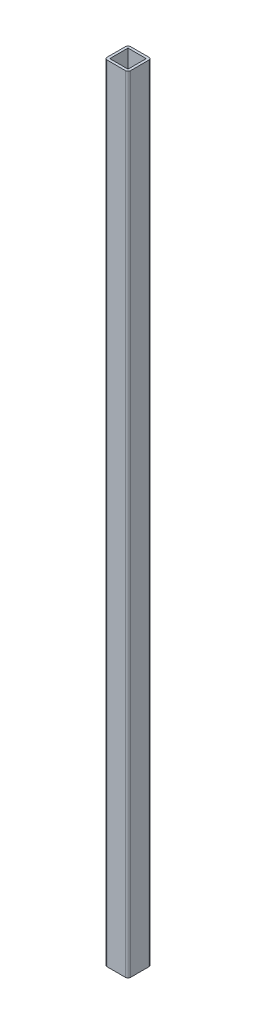
ISO-10303-21;
HEADER;
FILE_DESCRIPTION(('STEP AP214'),'2;1');
FILE_NAME('part.step','',(''),(''),'','','');
FILE_SCHEMA(('AUTOMOTIVE_DESIGN { 1 0 10303 214 1 1 1 1 }'));
ENDSEC;
DATA;
#1=APPLICATION_CONTEXT('core data for automotive mechanical design processes');
#2=APPLICATION_PROTOCOL_DEFINITION('international standard','automotive_design',2000,#1);
#3=PRODUCT_CONTEXT('',#1,'mechanical');
#4=PRODUCT('Part','Part','',(#3));
#5=PRODUCT_RELATED_PRODUCT_CATEGORY('part','',(#4));
#6=PRODUCT_DEFINITION_FORMATION('','',#4);
#7=PRODUCT_DEFINITION_CONTEXT('part definition',#1,'design');
#8=PRODUCT_DEFINITION('design','',#6,#7);
#9=PRODUCT_DEFINITION_SHAPE('','',#8);
#10=(LENGTH_UNIT() NAMED_UNIT(*) SI_UNIT(.MILLI.,.METRE.));
#11=(NAMED_UNIT(*) PLANE_ANGLE_UNIT() SI_UNIT($,.RADIAN.));
#12=(NAMED_UNIT(*) SI_UNIT($,.STERADIAN.) SOLID_ANGLE_UNIT());
#13=UNCERTAINTY_MEASURE_WITH_UNIT(LENGTH_MEASURE(1.E-05),#10,'distance_accuracy_value','');
#14=(GEOMETRIC_REPRESENTATION_CONTEXT(3) GLOBAL_UNCERTAINTY_ASSIGNED_CONTEXT((#13)) GLOBAL_UNIT_ASSIGNED_CONTEXT((#10,
#11,#12)) REPRESENTATION_CONTEXT('',''));
#15=CARTESIAN_POINT('',(0.,0.,0.));
#16=DIRECTION('',(0.,0.,1.));
#17=DIRECTION('',(1.,0.,0.));
#18=AXIS2_PLACEMENT_3D('',#15,#16,#17);
#19=CARTESIAN_POINT('',(22.8,861.,2.8));
#20=DIRECTION('',(0.,-1.,0.));
#21=DIRECTION('',(0.,0.,-1.));
#22=AXIS2_PLACEMENT_3D('',#19,#20,#21);
#23=CYLINDRICAL_SURFACE('',#22,2.8);
#24=CARTESIAN_POINT('',(22.8,0.,2.8));
#25=DIRECTION('',(0.,1.,0.));
#26=DIRECTION('',(0.,0.,-1.));
#27=AXIS2_PLACEMENT_3D('',#24,#25,#26);
#28=CIRCLE('',#27,2.8);
#29=CARTESIAN_POINT('',(25.6,0.,2.80000000000002));
#30=VERTEX_POINT('',#29);
#31=CARTESIAN_POINT('',(22.8,0.,0.));
#32=VERTEX_POINT('',#31);
#33=EDGE_CURVE('E153',#30,#32,#28,.T.);
#34=ORIENTED_EDGE('',*,*,#33,.T.);
#35=DIRECTION('',(0.,-1.,0.));
#36=VECTOR('',#35,1.);
#37=CARTESIAN_POINT('',(22.8,861.,0.));
#38=LINE('',#37,#36);
#39=CARTESIAN_POINT('',(22.8,861.,0.));
#40=VERTEX_POINT('',#39);
#41=EDGE_CURVE('E11',#40,#32,#38,.T.);
#42=ORIENTED_EDGE('',*,*,#41,.F.);
#43=CARTESIAN_POINT('',(22.8,861.,2.8));
#44=DIRECTION('',(0.,1.,0.));
#45=DIRECTION('',(0.,0.,-1.));
#46=AXIS2_PLACEMENT_3D('',#43,#44,#45);
#47=CIRCLE('',#46,2.8);
#48=CARTESIAN_POINT('',(25.6,861.,2.80000000000002));
#49=VERTEX_POINT('',#48);
#50=EDGE_CURVE('E157',#49,#40,#47,.T.);
#51=ORIENTED_EDGE('',*,*,#50,.F.);
#52=DIRECTION('',(0.,-1.,0.));
#53=VECTOR('',#52,1.);
#54=CARTESIAN_POINT('',(25.6,861.,2.80000000000002));
#55=LINE('',#54,#53);
#56=EDGE_CURVE('E175',#49,#30,#55,.T.);
#57=ORIENTED_EDGE('',*,*,#56,.T.);
#58=EDGE_LOOP('',(#34,#42,#51,#57));
#59=FACE_BOUND('',#58,.T.);
#60=ADVANCED_FACE('F32',(#59),#23,.T.);
#61=CARTESIAN_POINT('',(2.80000000000002,861.,0.));
#62=DIRECTION('',(0.,0.,1.));
#63=DIRECTION('',(1.,0.,0.));
#64=AXIS2_PLACEMENT_3D('',#61,#62,#63);
#65=PLANE('',#64);
#66=DIRECTION('',(-1.,0.,0.));
#67=VECTOR('',#66,1.);
#68=CARTESIAN_POINT('',(2.80000000000002,0.,0.));
#69=LINE('',#68,#67);
#70=CARTESIAN_POINT('',(2.80000000000002,0.,0.));
#71=VERTEX_POINT('',#70);
#72=EDGE_CURVE('E178',#32,#71,#69,.T.);
#73=ORIENTED_EDGE('',*,*,#72,.T.);
#74=DIRECTION('',(0.,-1.,0.));
#75=VECTOR('',#74,1.);
#76=CARTESIAN_POINT('',(2.80000000000002,861.,0.));
#77=LINE('',#76,#75);
#78=CARTESIAN_POINT('',(2.80000000000002,861.,0.));
#79=VERTEX_POINT('',#78);
#80=EDGE_CURVE('E39',#79,#71,#77,.T.);
#81=ORIENTED_EDGE('',*,*,#80,.F.);
#82=DIRECTION('',(-1.,0.,0.));
#83=VECTOR('',#82,1.);
#84=CARTESIAN_POINT('',(2.80000000000002,861.,0.));
#85=LINE('',#84,#83);
#86=EDGE_CURVE('E160',#40,#79,#85,.T.);
#87=ORIENTED_EDGE('',*,*,#86,.F.);
#88=ORIENTED_EDGE('',*,*,#41,.T.);
#89=EDGE_LOOP('',(#73,#81,#87,#88));
#90=FACE_BOUND('',#89,.T.);
#91=ADVANCED_FACE('F233',(#90),#65,.F.);
#92=CARTESIAN_POINT('',(2.8,861.,2.8));
#93=DIRECTION('',(0.,-1.,0.));
#94=DIRECTION('',(0.,0.,-1.));
#95=AXIS2_PLACEMENT_3D('',#92,#93,#94);
#96=CYLINDRICAL_SURFACE('',#95,2.8);
#97=CARTESIAN_POINT('',(2.8,0.,2.8));
#98=DIRECTION('',(0.,1.,0.));
#99=DIRECTION('',(0.,0.,1.));
#100=AXIS2_PLACEMENT_3D('',#97,#98,#99);
#101=CIRCLE('',#100,2.8);
#102=CARTESIAN_POINT('',(0.,0.,2.80000000000002));
#103=VERTEX_POINT('',#102);
#104=EDGE_CURVE('E180',#71,#103,#101,.T.);
#105=ORIENTED_EDGE('',*,*,#104,.T.);
#106=DIRECTION('',(0.,-1.,0.));
#107=VECTOR('',#106,1.);
#108=CARTESIAN_POINT('',(0.,861.,2.80000000000002));
#109=LINE('',#108,#107);
#110=CARTESIAN_POINT('',(0.,861.,2.80000000000002));
#111=VERTEX_POINT('',#110);
#112=EDGE_CURVE('E205',#111,#103,#109,.T.);
#113=ORIENTED_EDGE('',*,*,#112,.F.);
#114=CARTESIAN_POINT('',(2.8,861.,2.8));
#115=DIRECTION('',(0.,1.,0.));
#116=DIRECTION('',(0.,0.,1.));
#117=AXIS2_PLACEMENT_3D('',#114,#115,#116);
#118=CIRCLE('',#117,2.8);
#119=EDGE_CURVE('E163',#79,#111,#118,.T.);
#120=ORIENTED_EDGE('',*,*,#119,.F.);
#121=ORIENTED_EDGE('',*,*,#80,.T.);
#122=EDGE_LOOP('',(#105,#113,#120,#121));
#123=FACE_BOUND('',#122,.T.);
#124=ADVANCED_FACE('F212',(#123),#96,.T.);
#125=CARTESIAN_POINT('',(0.,861.,2.80000000000002));
#126=DIRECTION('',(1.,0.,0.));
#127=DIRECTION('',(0.,0.,-1.));
#128=AXIS2_PLACEMENT_3D('',#125,#126,#127);
#129=PLANE('',#128);
#130=DIRECTION('',(0.,0.,1.));
#131=VECTOR('',#130,1.);
#132=CARTESIAN_POINT('',(0.,0.,2.80000000000002));
#133=LINE('',#132,#131);
#134=CARTESIAN_POINT('',(0.,0.,22.8));
#135=VERTEX_POINT('',#134);
#136=EDGE_CURVE('E182',#103,#135,#133,.T.);
#137=ORIENTED_EDGE('',*,*,#136,.T.);
#138=DIRECTION('',(0.,-1.,0.));
#139=VECTOR('',#138,1.);
#140=CARTESIAN_POINT('',(0.,861.,22.8));
#141=LINE('',#140,#139);
#142=CARTESIAN_POINT('',(0.,861.,22.8));
#143=VERTEX_POINT('',#142);
#144=EDGE_CURVE('E202',#143,#135,#141,.T.);
#145=ORIENTED_EDGE('',*,*,#144,.F.);
#146=DIRECTION('',(0.,0.,1.));
#147=VECTOR('',#146,1.);
#148=CARTESIAN_POINT('',(0.,861.,2.80000000000002));
#149=LINE('',#148,#147);
#150=EDGE_CURVE('E165',#111,#143,#149,.T.);
#151=ORIENTED_EDGE('',*,*,#150,.F.);
#152=ORIENTED_EDGE('',*,*,#112,.T.);
#153=EDGE_LOOP('',(#137,#145,#151,#152));
#154=FACE_BOUND('',#153,.T.);
#155=ADVANCED_FACE('F223',(#154),#129,.F.);
#156=CARTESIAN_POINT('',(2.8,861.,22.8));
#157=DIRECTION('',(0.,-1.,0.));
#158=DIRECTION('',(0.,0.,-1.));
#159=AXIS2_PLACEMENT_3D('',#156,#157,#158);
#160=CYLINDRICAL_SURFACE('',#159,2.8);
#161=CARTESIAN_POINT('',(2.8,0.,22.8));
#162=DIRECTION('',(0.,1.,0.));
#163=DIRECTION('',(0.,0.,1.));
#164=AXIS2_PLACEMENT_3D('',#161,#162,#163);
#165=CIRCLE('',#164,2.8);
#166=CARTESIAN_POINT('',(2.80000000000002,0.,25.6));
#167=VERTEX_POINT('',#166);
#168=EDGE_CURVE('E184',#135,#167,#165,.T.);
#169=ORIENTED_EDGE('',*,*,#168,.T.);
#170=DIRECTION('',(0.,-1.,0.));
#171=VECTOR('',#170,1.);
#172=CARTESIAN_POINT('',(2.80000000000002,861.,25.6));
#173=LINE('',#172,#171);
#174=CARTESIAN_POINT('',(2.80000000000002,861.,25.6));
#175=VERTEX_POINT('',#174);
#176=EDGE_CURVE('E199',#175,#167,#173,.T.);
#177=ORIENTED_EDGE('',*,*,#176,.F.);
#178=CARTESIAN_POINT('',(2.8,861.,22.8));
#179=DIRECTION('',(0.,1.,0.));
#180=DIRECTION('',(0.,0.,1.));
#181=AXIS2_PLACEMENT_3D('',#178,#179,#180);
#182=CIRCLE('',#181,2.8);
#183=EDGE_CURVE('E167',#143,#175,#182,.T.);
#184=ORIENTED_EDGE('',*,*,#183,.F.);
#185=ORIENTED_EDGE('',*,*,#144,.T.);
#186=EDGE_LOOP('',(#169,#177,#184,#185));
#187=FACE_BOUND('',#186,.T.);
#188=ADVANCED_FACE('F227',(#187),#160,.T.);
#189=CARTESIAN_POINT('',(2.80000000000002,861.,25.6));
#190=DIRECTION('',(0.,0.,-1.));
#191=DIRECTION('',(-1.,0.,0.));
#192=AXIS2_PLACEMENT_3D('',#189,#190,#191);
#193=PLANE('',#192);
#194=DIRECTION('',(1.,0.,0.));
#195=VECTOR('',#194,1.);
#196=CARTESIAN_POINT('',(2.80000000000002,0.,25.6));
#197=LINE('',#196,#195);
#198=CARTESIAN_POINT('',(22.8,0.,25.6));
#199=VERTEX_POINT('',#198);
#200=EDGE_CURVE('E186',#167,#199,#197,.T.);
#201=ORIENTED_EDGE('',*,*,#200,.T.);
#202=DIRECTION('',(0.,-1.,0.));
#203=VECTOR('',#202,1.);
#204=CARTESIAN_POINT('',(22.8,861.,25.6));
#205=LINE('',#204,#203);
#206=CARTESIAN_POINT('',(22.8,861.,25.6));
#207=VERTEX_POINT('',#206);
#208=EDGE_CURVE('E196',#207,#199,#205,.T.);
#209=ORIENTED_EDGE('',*,*,#208,.F.);
#210=DIRECTION('',(1.,0.,0.));
#211=VECTOR('',#210,1.);
#212=CARTESIAN_POINT('',(2.80000000000002,861.,25.6));
#213=LINE('',#212,#211);
#214=EDGE_CURVE('E169',#175,#207,#213,.T.);
#215=ORIENTED_EDGE('',*,*,#214,.F.);
#216=ORIENTED_EDGE('',*,*,#176,.T.);
#217=EDGE_LOOP('',(#201,#209,#215,#216));
#218=FACE_BOUND('',#217,.T.);
#219=ADVANCED_FACE('F246',(#218),#193,.F.);
#220=CARTESIAN_POINT('',(22.8,861.,22.8));
#221=DIRECTION('',(0.,-1.,0.));
#222=DIRECTION('',(0.,0.,-1.));
#223=AXIS2_PLACEMENT_3D('',#220,#221,#222);
#224=CYLINDRICAL_SURFACE('',#223,2.8);
#225=CARTESIAN_POINT('',(22.8,0.,22.8));
#226=DIRECTION('',(0.,1.,0.));
#227=DIRECTION('',(0.,0.,1.));
#228=AXIS2_PLACEMENT_3D('',#225,#226,#227);
#229=CIRCLE('',#228,2.8);
#230=CARTESIAN_POINT('',(25.6,0.,22.8));
#231=VERTEX_POINT('',#230);
#232=EDGE_CURVE('E188',#199,#231,#229,.T.);
#233=ORIENTED_EDGE('',*,*,#232,.T.);
#234=DIRECTION('',(0.,-1.,0.));
#235=VECTOR('',#234,1.);
#236=CARTESIAN_POINT('',(25.6,861.,22.8));
#237=LINE('',#236,#235);
#238=CARTESIAN_POINT('',(25.6,861.,22.8));
#239=VERTEX_POINT('',#238);
#240=EDGE_CURVE('E193',#239,#231,#237,.T.);
#241=ORIENTED_EDGE('',*,*,#240,.F.);
#242=CARTESIAN_POINT('',(22.8,861.,22.8));
#243=DIRECTION('',(0.,1.,0.));
#244=DIRECTION('',(0.,0.,1.));
#245=AXIS2_PLACEMENT_3D('',#242,#243,#244);
#246=CIRCLE('',#245,2.8);
#247=EDGE_CURVE('E171',#207,#239,#246,.T.);
#248=ORIENTED_EDGE('',*,*,#247,.F.);
#249=ORIENTED_EDGE('',*,*,#208,.T.);
#250=EDGE_LOOP('',(#233,#241,#248,#249));
#251=FACE_BOUND('',#250,.T.);
#252=ADVANCED_FACE('F244',(#251),#224,.T.);
#253=CARTESIAN_POINT('',(25.6,861.,2.80000000000002));
#254=DIRECTION('',(-1.,0.,0.));
#255=DIRECTION('',(0.,0.,1.));
#256=AXIS2_PLACEMENT_3D('',#253,#254,#255);
#257=PLANE('',#256);
#258=DIRECTION('',(0.,0.,-1.));
#259=VECTOR('',#258,1.);
#260=CARTESIAN_POINT('',(25.6,0.,2.80000000000002));
#261=LINE('',#260,#259);
#262=EDGE_CURVE('E161',#231,#30,#261,.T.);
#263=ORIENTED_EDGE('',*,*,#262,.T.);
#264=ORIENTED_EDGE('',*,*,#56,.F.);
#265=DIRECTION('',(0.,0.,-1.));
#266=VECTOR('',#265,1.);
#267=CARTESIAN_POINT('',(25.6,861.,2.80000000000002));
#268=LINE('',#267,#266);
#269=EDGE_CURVE('E173',#239,#49,#268,.T.);
#270=ORIENTED_EDGE('',*,*,#269,.F.);
#271=ORIENTED_EDGE('',*,*,#240,.T.);
#272=EDGE_LOOP('',(#263,#264,#270,#271));
#273=FACE_BOUND('',#272,.T.);
#274=ADVANCED_FACE('F239',(#273),#257,.F.);
#275=CARTESIAN_POINT('',(22.8,861.,2.8));
#276=DIRECTION('',(0.,-1.,0.));
#277=DIRECTION('',(0.,0.,-1.));
#278=AXIS2_PLACEMENT_3D('',#275,#276,#277);
#279=PLANE('',#278);
#280=DIRECTION('',(1.,0.,0.));
#281=VECTOR('',#280,1.);
#282=CARTESIAN_POINT('',(2.8,861.,2.8));
#283=LINE('',#282,#281);
#284=CARTESIAN_POINT('',(2.8,861.,2.8));
#285=VERTEX_POINT('',#284);
#286=CARTESIAN_POINT('',(22.8,861.,2.8));
#287=VERTEX_POINT('',#286);
#288=EDGE_CURVE('E128',#285,#287,#283,.T.);
#289=ORIENTED_EDGE('',*,*,#288,.T.);
#290=DIRECTION('',(0.,0.,1.));
#291=VECTOR('',#290,1.);
#292=CARTESIAN_POINT('',(22.8,861.,2.8));
#293=LINE('',#292,#291);
#294=CARTESIAN_POINT('',(22.8,861.,22.8));
#295=VERTEX_POINT('',#294);
#296=EDGE_CURVE('E122',#287,#295,#293,.T.);
#297=ORIENTED_EDGE('',*,*,#296,.T.);
#298=DIRECTION('',(-1.,0.,0.));
#299=VECTOR('',#298,1.);
#300=CARTESIAN_POINT('',(2.8,861.,22.8));
#301=LINE('',#300,#299);
#302=CARTESIAN_POINT('',(2.8,861.,22.8));
#303=VERTEX_POINT('',#302);
#304=EDGE_CURVE('E131',#295,#303,#301,.T.);
#305=ORIENTED_EDGE('',*,*,#304,.T.);
#306=DIRECTION('',(0.,0.,-1.));
#307=VECTOR('',#306,1.);
#308=CARTESIAN_POINT('',(2.8,861.,2.8));
#309=LINE('',#308,#307);
#310=EDGE_CURVE('E46',#303,#285,#309,.T.);
#311=ORIENTED_EDGE('',*,*,#310,.T.);
#312=EDGE_LOOP('',(#289,#297,#305,#311));
#313=FACE_BOUND('',#312,.T.);
#314=ORIENTED_EDGE('',*,*,#50,.T.);
#315=ORIENTED_EDGE('',*,*,#86,.T.);
#316=ORIENTED_EDGE('',*,*,#119,.T.);
#317=ORIENTED_EDGE('',*,*,#150,.T.);
#318=ORIENTED_EDGE('',*,*,#183,.T.);
#319=ORIENTED_EDGE('',*,*,#214,.T.);
#320=ORIENTED_EDGE('',*,*,#247,.T.);
#321=ORIENTED_EDGE('',*,*,#269,.T.);
#322=EDGE_LOOP('',(#314,#315,#316,#317,#318,#319,#320,#321));
#323=FACE_BOUND('',#322,.T.);
#324=ADVANCED_FACE('F135',(#313,#323),#279,.F.);
#325=CARTESIAN_POINT('',(22.8,0.,2.8));
#326=DIRECTION('',(0.,-1.,0.));
#327=DIRECTION('',(0.,0.,-1.));
#328=AXIS2_PLACEMENT_3D('',#325,#326,#327);
#329=PLANE('',#328);
#330=DIRECTION('',(0.,0.,1.));
#331=VECTOR('',#330,1.);
#332=CARTESIAN_POINT('',(22.8,0.,2.8));
#333=LINE('',#332,#331);
#334=CARTESIAN_POINT('',(22.8,0.,2.8));
#335=VERTEX_POINT('',#334);
#336=CARTESIAN_POINT('',(22.8,0.,22.8));
#337=VERTEX_POINT('',#336);
#338=EDGE_CURVE('E54',#335,#337,#333,.T.);
#339=ORIENTED_EDGE('',*,*,#338,.F.);
#340=DIRECTION('',(1.,0.,0.));
#341=VECTOR('',#340,1.);
#342=CARTESIAN_POINT('',(2.8,0.,2.8));
#343=LINE('',#342,#341);
#344=CARTESIAN_POINT('',(2.8,0.,2.8));
#345=VERTEX_POINT('',#344);
#346=EDGE_CURVE('E138',#345,#335,#343,.T.);
#347=ORIENTED_EDGE('',*,*,#346,.F.);
#348=DIRECTION('',(0.,0.,-1.));
#349=VECTOR('',#348,1.);
#350=CARTESIAN_POINT('',(2.8,0.,2.8));
#351=LINE('',#350,#349);
#352=CARTESIAN_POINT('',(2.8,0.,22.8));
#353=VERTEX_POINT('',#352);
#354=EDGE_CURVE('E141',#353,#345,#351,.T.);
#355=ORIENTED_EDGE('',*,*,#354,.F.);
#356=DIRECTION('',(-1.,0.,0.));
#357=VECTOR('',#356,1.);
#358=CARTESIAN_POINT('',(2.8,0.,22.8));
#359=LINE('',#358,#357);
#360=EDGE_CURVE('E147',#337,#353,#359,.T.);
#361=ORIENTED_EDGE('',*,*,#360,.F.);
#362=EDGE_LOOP('',(#339,#347,#355,#361));
#363=FACE_BOUND('',#362,.T.);
#364=ORIENTED_EDGE('',*,*,#33,.F.);
#365=ORIENTED_EDGE('',*,*,#262,.F.);
#366=ORIENTED_EDGE('',*,*,#232,.F.);
#367=ORIENTED_EDGE('',*,*,#200,.F.);
#368=ORIENTED_EDGE('',*,*,#168,.F.);
#369=ORIENTED_EDGE('',*,*,#136,.F.);
#370=ORIENTED_EDGE('',*,*,#104,.F.);
#371=ORIENTED_EDGE('',*,*,#72,.F.);
#372=EDGE_LOOP('',(#364,#365,#366,#367,#368,#369,#370,#371));
#373=FACE_BOUND('',#372,.T.);
#374=ADVANCED_FACE('F218',(#363,#373),#329,.T.);
#375=CARTESIAN_POINT('',(22.8,861.,2.8));
#376=DIRECTION('',(1.,0.,0.));
#377=DIRECTION('',(0.,0.,-1.));
#378=AXIS2_PLACEMENT_3D('',#375,#376,#377);
#379=PLANE('',#378);
#380=ORIENTED_EDGE('',*,*,#338,.T.);
#381=DIRECTION('',(0.,-1.,0.));
#382=VECTOR('',#381,1.);
#383=CARTESIAN_POINT('',(22.8,861.,22.8));
#384=LINE('',#383,#382);
#385=EDGE_CURVE('E118',#295,#337,#384,.T.);
#386=ORIENTED_EDGE('',*,*,#385,.F.);
#387=ORIENTED_EDGE('',*,*,#296,.F.);
#388=DIRECTION('',(0.,-1.,0.));
#389=VECTOR('',#388,1.);
#390=CARTESIAN_POINT('',(22.8,861.,2.8));
#391=LINE('',#390,#389);
#392=EDGE_CURVE('E151',#287,#335,#391,.T.);
#393=ORIENTED_EDGE('',*,*,#392,.T.);
#394=EDGE_LOOP('',(#380,#386,#387,#393));
#395=FACE_BOUND('',#394,.T.);
#396=ADVANCED_FACE('F120',(#395),#379,.F.);
#397=CARTESIAN_POINT('',(2.8,861.,2.8));
#398=DIRECTION('',(0.,0.,-1.));
#399=DIRECTION('',(-1.,0.,0.));
#400=AXIS2_PLACEMENT_3D('',#397,#398,#399);
#401=PLANE('',#400);
#402=ORIENTED_EDGE('',*,*,#346,.T.);
#403=ORIENTED_EDGE('',*,*,#392,.F.);
#404=ORIENTED_EDGE('',*,*,#288,.F.);
#405=DIRECTION('',(0.,-1.,0.));
#406=VECTOR('',#405,1.);
#407=CARTESIAN_POINT('',(2.8,861.,2.8));
#408=LINE('',#407,#406);
#409=EDGE_CURVE('E154',#285,#345,#408,.T.);
#410=ORIENTED_EDGE('',*,*,#409,.T.);
#411=EDGE_LOOP('',(#402,#403,#404,#410));
#412=FACE_BOUND('',#411,.T.);
#413=ADVANCED_FACE('F317',(#412),#401,.F.);
#414=CARTESIAN_POINT('',(2.8,861.,2.8));
#415=DIRECTION('',(-1.,0.,0.));
#416=DIRECTION('',(0.,0.,1.));
#417=AXIS2_PLACEMENT_3D('',#414,#415,#416);
#418=PLANE('',#417);
#419=ORIENTED_EDGE('',*,*,#354,.T.);
#420=ORIENTED_EDGE('',*,*,#409,.F.);
#421=ORIENTED_EDGE('',*,*,#310,.F.);
#422=DIRECTION('',(0.,-1.,0.));
#423=VECTOR('',#422,1.);
#424=CARTESIAN_POINT('',(2.8,861.,22.8));
#425=LINE('',#424,#423);
#426=EDGE_CURVE('E127',#303,#353,#425,.T.);
#427=ORIENTED_EDGE('',*,*,#426,.T.);
#428=EDGE_LOOP('',(#419,#420,#421,#427));
#429=FACE_BOUND('',#428,.T.);
#430=ADVANCED_FACE('F326',(#429),#418,.F.);
#431=CARTESIAN_POINT('',(2.8,861.,22.8));
#432=DIRECTION('',(0.,0.,1.));
#433=DIRECTION('',(1.,0.,0.));
#434=AXIS2_PLACEMENT_3D('',#431,#432,#433);
#435=PLANE('',#434);
#436=ORIENTED_EDGE('',*,*,#360,.T.);
#437=ORIENTED_EDGE('',*,*,#426,.F.);
#438=ORIENTED_EDGE('',*,*,#304,.F.);
#439=ORIENTED_EDGE('',*,*,#385,.T.);
#440=EDGE_LOOP('',(#436,#437,#438,#439));
#441=FACE_BOUND('',#440,.T.);
#442=ADVANCED_FACE('F132',(#441),#435,.F.);
#443=CLOSED_SHELL('',(#60,#91,#124,#155,#188,#219,#252,#274,#324,#374,#396,#413,#430,#442));
#444=MANIFOLD_SOLID_BREP('B2',#443);
#445=ADVANCED_BREP_SHAPE_REPRESENTATION('',(#18,#444),#14);
#446=SHAPE_DEFINITION_REPRESENTATION(#9,#445);
ENDSEC;
END-ISO-10303-21;
